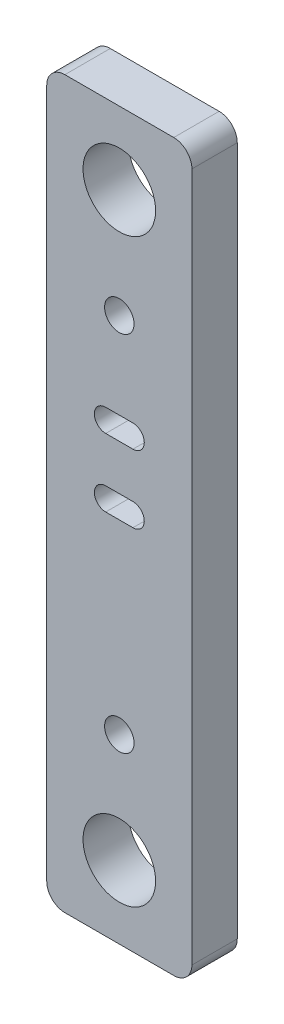
ISO-10303-21;
HEADER;
FILE_DESCRIPTION(('STEP AP214'),'2;1');
FILE_NAME('part.step','',(''),(''),'','','');
FILE_SCHEMA(('AUTOMOTIVE_DESIGN { 1 0 10303 214 1 1 1 1 }'));
ENDSEC;
DATA;
#1=APPLICATION_CONTEXT('core data for automotive mechanical design processes');
#2=APPLICATION_PROTOCOL_DEFINITION('international standard','automotive_design',2000,#1);
#3=PRODUCT_CONTEXT('',#1,'mechanical');
#4=PRODUCT('Part','Part','',(#3));
#5=PRODUCT_RELATED_PRODUCT_CATEGORY('part','',(#4));
#6=PRODUCT_DEFINITION_FORMATION('','',#4);
#7=PRODUCT_DEFINITION_CONTEXT('part definition',#1,'design');
#8=PRODUCT_DEFINITION('design','',#6,#7);
#9=PRODUCT_DEFINITION_SHAPE('','',#8);
#10=(LENGTH_UNIT() NAMED_UNIT(*) SI_UNIT(.MILLI.,.METRE.));
#11=(NAMED_UNIT(*) PLANE_ANGLE_UNIT() SI_UNIT($,.RADIAN.));
#12=(NAMED_UNIT(*) SI_UNIT($,.STERADIAN.) SOLID_ANGLE_UNIT());
#13=UNCERTAINTY_MEASURE_WITH_UNIT(LENGTH_MEASURE(1.E-05),#10,'distance_accuracy_value','');
#14=(GEOMETRIC_REPRESENTATION_CONTEXT(3) GLOBAL_UNCERTAINTY_ASSIGNED_CONTEXT((#13)) GLOBAL_UNIT_ASSIGNED_CONTEXT((#10,
#11,#12)) REPRESENTATION_CONTEXT('',''));
#15=CARTESIAN_POINT('',(0.,0.,0.));
#16=DIRECTION('',(0.,0.,1.));
#17=DIRECTION('',(1.,0.,0.));
#18=AXIS2_PLACEMENT_3D('',#15,#16,#17);
#19=CARTESIAN_POINT('',(0.,0.,5.));
#20=DIRECTION('',(0.,0.,-1.));
#21=DIRECTION('',(-1.,0.,0.));
#22=AXIS2_PLACEMENT_3D('',#19,#20,#21);
#23=PLANE('',#22);
#24=CARTESIAN_POINT('',(6.5,49.25,5.));
#25=DIRECTION('',(0.,0.,1.));
#26=DIRECTION('',(1.,0.,0.));
#27=AXIS2_PLACEMENT_3D('',#24,#25,#26);
#28=CIRCLE('',#27,1.24999999999999);
#29=CARTESIAN_POINT('',(6.5,50.5,5.));
#30=VERTEX_POINT('',#29);
#31=CARTESIAN_POINT('',(6.49999999999999,48.,5.));
#32=VERTEX_POINT('',#31);
#33=EDGE_CURVE('E206',#30,#32,#28,.T.);
#34=ORIENTED_EDGE('',*,*,#33,.F.);
#35=DIRECTION('',(-1.,0.,0.));
#36=VECTOR('',#35,1.);
#37=CARTESIAN_POINT('',(6.5,50.5,5.));
#38=LINE('',#37,#36);
#39=CARTESIAN_POINT('',(9.49999999999999,50.5,5.));
#40=VERTEX_POINT('',#39);
#41=EDGE_CURVE('E214',#40,#30,#38,.T.);
#42=ORIENTED_EDGE('',*,*,#41,.F.);
#43=CARTESIAN_POINT('',(9.49999999999999,49.25,5.));
#44=DIRECTION('',(0.,0.,1.));
#45=DIRECTION('',(1.,0.,0.));
#46=AXIS2_PLACEMENT_3D('',#43,#44,#45);
#47=CIRCLE('',#46,1.24999999999999);
#48=CARTESIAN_POINT('',(9.49999999999999,48.,5.));
#49=VERTEX_POINT('',#48);
#50=EDGE_CURVE('E211',#49,#40,#47,.T.);
#51=ORIENTED_EDGE('',*,*,#50,.F.);
#52=DIRECTION('',(1.,0.,0.));
#53=VECTOR('',#52,1.);
#54=CARTESIAN_POINT('',(6.49999999999999,48.,5.));
#55=LINE('',#54,#53);
#56=EDGE_CURVE('E208',#32,#49,#55,.T.);
#57=ORIENTED_EDGE('',*,*,#56,.F.);
#58=EDGE_LOOP('',(#34,#42,#51,#57));
#59=FACE_BOUND('',#58,.T.);
#60=DIRECTION('',(0.,-1.,0.));
#61=VECTOR('',#60,1.);
#62=CARTESIAN_POINT('',(0.,0.,5.));
#63=LINE('',#62,#61);
#64=CARTESIAN_POINT('',(0.,78.,5.));
#65=VERTEX_POINT('',#64);
#66=CARTESIAN_POINT('',(0.,2.,5.));
#67=VERTEX_POINT('',#66);
#68=EDGE_CURVE('E249',#65,#67,#63,.T.);
#69=ORIENTED_EDGE('',*,*,#68,.T.);
#70=CARTESIAN_POINT('',(2.,2.,5.));
#71=DIRECTION('',(0.,0.,-1.));
#72=DIRECTION('',(-1.,0.,0.));
#73=AXIS2_PLACEMENT_3D('',#70,#71,#72);
#74=CIRCLE('',#73,2.);
#75=CARTESIAN_POINT('',(2.,0.,5.));
#76=VERTEX_POINT('',#75);
#77=EDGE_CURVE('E292',#67,#76,#74,.F.);
#78=ORIENTED_EDGE('',*,*,#77,.T.);
#79=DIRECTION('',(1.,0.,0.));
#80=VECTOR('',#79,1.);
#81=CARTESIAN_POINT('',(0.,0.,5.));
#82=LINE('',#81,#80);
#83=CARTESIAN_POINT('',(14.,0.,5.));
#84=VERTEX_POINT('',#83);
#85=EDGE_CURVE('E252',#76,#84,#82,.T.);
#86=ORIENTED_EDGE('',*,*,#85,.T.);
#87=CARTESIAN_POINT('',(14.,2.,5.));
#88=DIRECTION('',(0.,0.,-1.));
#89=DIRECTION('',(-1.,0.,0.));
#90=AXIS2_PLACEMENT_3D('',#87,#88,#89);
#91=CIRCLE('',#90,2.);
#92=CARTESIAN_POINT('',(16.,2.,5.));
#93=VERTEX_POINT('',#92);
#94=EDGE_CURVE('E290',#84,#93,#91,.F.);
#95=ORIENTED_EDGE('',*,*,#94,.T.);
#96=DIRECTION('',(0.,1.,0.));
#97=VECTOR('',#96,1.);
#98=CARTESIAN_POINT('',(16.,0.,5.));
#99=LINE('',#98,#97);
#100=CARTESIAN_POINT('',(16.,78.,5.));
#101=VERTEX_POINT('',#100);
#102=EDGE_CURVE('E256',#93,#101,#99,.T.);
#103=ORIENTED_EDGE('',*,*,#102,.T.);
#104=CARTESIAN_POINT('',(14.,78.,5.));
#105=DIRECTION('',(0.,0.,-1.));
#106=DIRECTION('',(-1.,0.,0.));
#107=AXIS2_PLACEMENT_3D('',#104,#105,#106);
#108=CIRCLE('',#107,2.);
#109=CARTESIAN_POINT('',(14.,80.,5.));
#110=VERTEX_POINT('',#109);
#111=EDGE_CURVE('E68',#101,#110,#108,.F.);
#112=ORIENTED_EDGE('',*,*,#111,.T.);
#113=DIRECTION('',(-1.,0.,0.));
#114=VECTOR('',#113,1.);
#115=CARTESIAN_POINT('',(0.,80.,5.));
#116=LINE('',#115,#114);
#117=CARTESIAN_POINT('',(2.,80.,5.));
#118=VERTEX_POINT('',#117);
#119=EDGE_CURVE('E258',#110,#118,#116,.T.);
#120=ORIENTED_EDGE('',*,*,#119,.T.);
#121=CARTESIAN_POINT('',(2.,78.,5.));
#122=DIRECTION('',(0.,0.,-1.));
#123=DIRECTION('',(-1.,0.,0.));
#124=AXIS2_PLACEMENT_3D('',#121,#122,#123);
#125=CIRCLE('',#124,2.);
#126=EDGE_CURVE('E287',#118,#65,#125,.F.);
#127=ORIENTED_EDGE('',*,*,#126,.T.);
#128=EDGE_LOOP('',(#69,#78,#86,#95,#103,#112,#120,#127));
#129=FACE_BOUND('',#128,.T.);
#130=CARTESIAN_POINT('',(8.,72.,5.));
#131=DIRECTION('',(0.,0.,1.));
#132=DIRECTION('',(1.,0.,0.));
#133=AXIS2_PLACEMENT_3D('',#130,#131,#132);
#134=CIRCLE('',#133,4.00000000000001);
#135=CARTESIAN_POINT('',(12.,72.,5.));
#136=VERTEX_POINT('',#135);
#137=EDGE_CURVE('E243',#136,#136,#134,.T.);
#138=ORIENTED_EDGE('',*,*,#137,.F.);
#139=EDGE_LOOP('',(#138));
#140=FACE_BOUND('',#139,.T.);
#141=CARTESIAN_POINT('',(8.00000000000001,8.,5.));
#142=DIRECTION('',(0.,0.,1.));
#143=DIRECTION('',(1.,0.,0.));
#144=AXIS2_PLACEMENT_3D('',#141,#142,#143);
#145=CIRCLE('',#144,4.);
#146=CARTESIAN_POINT('',(12.,8.,5.));
#147=VERTEX_POINT('',#146);
#148=EDGE_CURVE('E237',#147,#147,#145,.T.);
#149=ORIENTED_EDGE('',*,*,#148,.F.);
#150=EDGE_LOOP('',(#149));
#151=FACE_BOUND('',#150,.T.);
#152=CARTESIAN_POINT('',(6.49999999999999,41.75,5.));
#153=DIRECTION('',(0.,0.,1.));
#154=DIRECTION('',(1.,0.,0.));
#155=AXIS2_PLACEMENT_3D('',#152,#153,#154);
#156=CIRCLE('',#155,1.25);
#157=CARTESIAN_POINT('',(6.49999999999999,43.,5.));
#158=VERTEX_POINT('',#157);
#159=CARTESIAN_POINT('',(6.49999999999999,40.5,5.));
#160=VERTEX_POINT('',#159);
#161=EDGE_CURVE('E162',#158,#160,#156,.T.);
#162=ORIENTED_EDGE('',*,*,#161,.F.);
#163=DIRECTION('',(-1.,0.,0.));
#164=VECTOR('',#163,1.);
#165=CARTESIAN_POINT('',(6.49999999999999,43.,5.));
#166=LINE('',#165,#164);
#167=CARTESIAN_POINT('',(9.5,43.,5.));
#168=VERTEX_POINT('',#167);
#169=EDGE_CURVE('E188',#168,#158,#166,.T.);
#170=ORIENTED_EDGE('',*,*,#169,.F.);
#171=CARTESIAN_POINT('',(9.49999999999999,41.75,5.));
#172=DIRECTION('',(0.,0.,1.));
#173=DIRECTION('',(1.,0.,0.));
#174=AXIS2_PLACEMENT_3D('',#171,#172,#173);
#175=CIRCLE('',#174,1.25);
#176=CARTESIAN_POINT('',(9.5,40.5,5.));
#177=VERTEX_POINT('',#176);
#178=EDGE_CURVE('E186',#177,#168,#175,.T.);
#179=ORIENTED_EDGE('',*,*,#178,.F.);
#180=DIRECTION('',(1.,0.,0.));
#181=VECTOR('',#180,1.);
#182=CARTESIAN_POINT('',(6.49999999999999,40.5,5.));
#183=LINE('',#182,#181);
#184=EDGE_CURVE('E172',#160,#177,#183,.T.);
#185=ORIENTED_EDGE('',*,*,#184,.F.);
#186=EDGE_LOOP('',(#162,#170,#179,#185));
#187=FACE_BOUND('',#186,.T.);
#188=CARTESIAN_POINT('',(8.00000000000001,20.,5.));
#189=DIRECTION('',(0.,0.,1.));
#190=DIRECTION('',(1.,0.,0.));
#191=AXIS2_PLACEMENT_3D('',#188,#189,#190);
#192=CIRCLE('',#191,1.625);
#193=CARTESIAN_POINT('',(9.62500000000001,20.,5.));
#194=VERTEX_POINT('',#193);
#195=EDGE_CURVE('E195',#194,#194,#192,.T.);
#196=ORIENTED_EDGE('',*,*,#195,.F.);
#197=EDGE_LOOP('',(#196));
#198=FACE_BOUND('',#197,.T.);
#199=CARTESIAN_POINT('',(8.,60.,5.));
#200=DIRECTION('',(0.,0.,1.));
#201=DIRECTION('',(1.,0.,0.));
#202=AXIS2_PLACEMENT_3D('',#199,#200,#201);
#203=CIRCLE('',#202,1.625);
#204=CARTESIAN_POINT('',(9.62500000000001,60.,5.));
#205=VERTEX_POINT('',#204);
#206=EDGE_CURVE('E533',#205,#205,#203,.T.);
#207=ORIENTED_EDGE('',*,*,#206,.F.);
#208=EDGE_LOOP('',(#207));
#209=FACE_BOUND('',#208,.T.);
#210=ADVANCED_FACE('F47',(#59,#129,#140,#151,#187,#198,#209),#23,.F.);
#211=CARTESIAN_POINT('',(0.,0.,0.));
#212=DIRECTION('',(0.,0.,-1.));
#213=DIRECTION('',(-1.,0.,0.));
#214=AXIS2_PLACEMENT_3D('',#211,#212,#213);
#215=PLANE('',#214);
#216=CARTESIAN_POINT('',(8.00000000000001,20.,0.));
#217=DIRECTION('',(0.,0.,1.));
#218=DIRECTION('',(1.,0.,0.));
#219=AXIS2_PLACEMENT_3D('',#216,#217,#218);
#220=CIRCLE('',#219,1.625);
#221=CARTESIAN_POINT('',(9.62500000000001,20.,0.));
#222=VERTEX_POINT('',#221);
#223=EDGE_CURVE('E539',#222,#222,#220,.T.);
#224=ORIENTED_EDGE('',*,*,#223,.T.);
#225=EDGE_LOOP('',(#224));
#226=FACE_BOUND('',#225,.T.);
#227=CARTESIAN_POINT('',(8.,72.,0.));
#228=DIRECTION('',(0.,0.,1.));
#229=DIRECTION('',(1.,0.,0.));
#230=AXIS2_PLACEMENT_3D('',#227,#228,#229);
#231=CIRCLE('',#230,4.00000000000001);
#232=CARTESIAN_POINT('',(12.,72.,0.));
#233=VERTEX_POINT('',#232);
#234=EDGE_CURVE('E240',#233,#233,#231,.T.);
#235=ORIENTED_EDGE('',*,*,#234,.T.);
#236=EDGE_LOOP('',(#235));
#237=FACE_BOUND('',#236,.T.);
#238=DIRECTION('',(1.,0.,0.));
#239=VECTOR('',#238,1.);
#240=CARTESIAN_POINT('',(0.,0.,0.));
#241=LINE('',#240,#239);
#242=CARTESIAN_POINT('',(2.,0.,0.));
#243=VERTEX_POINT('',#242);
#244=CARTESIAN_POINT('',(14.,0.,0.));
#245=VERTEX_POINT('',#244);
#246=EDGE_CURVE('E263',#243,#245,#241,.T.);
#247=ORIENTED_EDGE('',*,*,#246,.F.);
#248=CARTESIAN_POINT('',(2.,2.,0.));
#249=DIRECTION('',(0.,0.,-1.));
#250=DIRECTION('',(-1.,0.,0.));
#251=AXIS2_PLACEMENT_3D('',#248,#249,#250);
#252=CIRCLE('',#251,2.);
#253=CARTESIAN_POINT('',(0.,2.,0.));
#254=VERTEX_POINT('',#253);
#255=EDGE_CURVE('E280',#243,#254,#252,.T.);
#256=ORIENTED_EDGE('',*,*,#255,.T.);
#257=DIRECTION('',(0.,-1.,0.));
#258=VECTOR('',#257,1.);
#259=CARTESIAN_POINT('',(0.,0.,0.));
#260=LINE('',#259,#258);
#261=CARTESIAN_POINT('',(0.,78.,0.));
#262=VERTEX_POINT('',#261);
#263=EDGE_CURVE('E246',#262,#254,#260,.T.);
#264=ORIENTED_EDGE('',*,*,#263,.F.);
#265=CARTESIAN_POINT('',(2.,78.,0.));
#266=DIRECTION('',(0.,0.,-1.));
#267=DIRECTION('',(-1.,0.,0.));
#268=AXIS2_PLACEMENT_3D('',#265,#266,#267);
#269=CIRCLE('',#268,2.);
#270=CARTESIAN_POINT('',(2.,80.,0.));
#271=VERTEX_POINT('',#270);
#272=EDGE_CURVE('E274',#262,#271,#269,.T.);
#273=ORIENTED_EDGE('',*,*,#272,.T.);
#274=DIRECTION('',(-1.,0.,0.));
#275=VECTOR('',#274,1.);
#276=CARTESIAN_POINT('',(0.,80.,0.));
#277=LINE('',#276,#275);
#278=CARTESIAN_POINT('',(14.,80.,0.));
#279=VERTEX_POINT('',#278);
#280=EDGE_CURVE('E253',#279,#271,#277,.T.);
#281=ORIENTED_EDGE('',*,*,#280,.F.);
#282=CARTESIAN_POINT('',(14.,78.,0.));
#283=DIRECTION('',(0.,0.,-1.));
#284=DIRECTION('',(-1.,0.,0.));
#285=AXIS2_PLACEMENT_3D('',#282,#283,#284);
#286=CIRCLE('',#285,2.);
#287=CARTESIAN_POINT('',(16.,78.,0.));
#288=VERTEX_POINT('',#287);
#289=EDGE_CURVE('E276',#279,#288,#286,.T.);
#290=ORIENTED_EDGE('',*,*,#289,.T.);
#291=DIRECTION('',(0.,1.,0.));
#292=VECTOR('',#291,1.);
#293=CARTESIAN_POINT('',(16.,0.,0.));
#294=LINE('',#293,#292);
#295=CARTESIAN_POINT('',(16.,2.,0.));
#296=VERTEX_POINT('',#295);
#297=EDGE_CURVE('E266',#296,#288,#294,.T.);
#298=ORIENTED_EDGE('',*,*,#297,.F.);
#299=CARTESIAN_POINT('',(14.,2.,0.));
#300=DIRECTION('',(0.,0.,-1.));
#301=DIRECTION('',(-1.,0.,0.));
#302=AXIS2_PLACEMENT_3D('',#299,#300,#301);
#303=CIRCLE('',#302,2.);
#304=EDGE_CURVE('E278',#296,#245,#303,.T.);
#305=ORIENTED_EDGE('',*,*,#304,.T.);
#306=EDGE_LOOP('',(#247,#256,#264,#273,#281,#290,#298,#305));
#307=FACE_BOUND('',#306,.T.);
#308=CARTESIAN_POINT('',(8.00000000000001,8.,0.));
#309=DIRECTION('',(0.,0.,1.));
#310=DIRECTION('',(1.,0.,0.));
#311=AXIS2_PLACEMENT_3D('',#308,#309,#310);
#312=CIRCLE('',#311,4.);
#313=CARTESIAN_POINT('',(12.,8.,0.));
#314=VERTEX_POINT('',#313);
#315=EDGE_CURVE('E236',#314,#314,#312,.T.);
#316=ORIENTED_EDGE('',*,*,#315,.T.);
#317=EDGE_LOOP('',(#316));
#318=FACE_BOUND('',#317,.T.);
#319=DIRECTION('',(-1.,0.,0.));
#320=VECTOR('',#319,1.);
#321=CARTESIAN_POINT('',(6.5,50.5,0.));
#322=LINE('',#321,#320);
#323=CARTESIAN_POINT('',(9.49999999999999,50.5,0.));
#324=VERTEX_POINT('',#323);
#325=CARTESIAN_POINT('',(6.5,50.5,0.));
#326=VERTEX_POINT('',#325);
#327=EDGE_CURVE('E209',#324,#326,#322,.T.);
#328=ORIENTED_EDGE('',*,*,#327,.T.);
#329=CARTESIAN_POINT('',(6.5,49.25,0.));
#330=DIRECTION('',(0.,0.,1.));
#331=DIRECTION('',(1.,0.,0.));
#332=AXIS2_PLACEMENT_3D('',#329,#330,#331);
#333=CIRCLE('',#332,1.24999999999999);
#334=CARTESIAN_POINT('',(6.49999999999999,48.,0.));
#335=VERTEX_POINT('',#334);
#336=EDGE_CURVE('E180',#326,#335,#333,.T.);
#337=ORIENTED_EDGE('',*,*,#336,.T.);
#338=DIRECTION('',(1.,0.,0.));
#339=VECTOR('',#338,1.);
#340=CARTESIAN_POINT('',(6.49999999999999,48.,0.));
#341=LINE('',#340,#339);
#342=CARTESIAN_POINT('',(9.49999999999999,48.,0.));
#343=VERTEX_POINT('',#342);
#344=EDGE_CURVE('E219',#335,#343,#341,.T.);
#345=ORIENTED_EDGE('',*,*,#344,.T.);
#346=CARTESIAN_POINT('',(9.49999999999999,49.25,0.));
#347=DIRECTION('',(0.,0.,1.));
#348=DIRECTION('',(1.,0.,0.));
#349=AXIS2_PLACEMENT_3D('',#346,#347,#348);
#350=CIRCLE('',#349,1.24999999999999);
#351=EDGE_CURVE('E222',#343,#324,#350,.T.);
#352=ORIENTED_EDGE('',*,*,#351,.T.);
#353=EDGE_LOOP('',(#328,#337,#345,#352));
#354=FACE_BOUND('',#353,.T.);
#355=DIRECTION('',(-1.,0.,0.));
#356=VECTOR('',#355,1.);
#357=CARTESIAN_POINT('',(6.49999999999999,43.,0.));
#358=LINE('',#357,#356);
#359=CARTESIAN_POINT('',(9.5,43.,0.));
#360=VERTEX_POINT('',#359);
#361=CARTESIAN_POINT('',(6.49999999999999,43.,0.));
#362=VERTEX_POINT('',#361);
#363=EDGE_CURVE('E173',#360,#362,#358,.T.);
#364=ORIENTED_EDGE('',*,*,#363,.T.);
#365=CARTESIAN_POINT('',(6.49999999999999,41.75,0.));
#366=DIRECTION('',(0.,0.,1.));
#367=DIRECTION('',(1.,0.,0.));
#368=AXIS2_PLACEMENT_3D('',#365,#366,#367);
#369=CIRCLE('',#368,1.25);
#370=CARTESIAN_POINT('',(6.49999999999999,40.5,0.));
#371=VERTEX_POINT('',#370);
#372=EDGE_CURVE('E193',#362,#371,#369,.T.);
#373=ORIENTED_EDGE('',*,*,#372,.T.);
#374=DIRECTION('',(1.,0.,0.));
#375=VECTOR('',#374,1.);
#376=CARTESIAN_POINT('',(6.49999999999999,40.5,0.));
#377=LINE('',#376,#375);
#378=CARTESIAN_POINT('',(9.5,40.5,0.));
#379=VERTEX_POINT('',#378);
#380=EDGE_CURVE('E179',#371,#379,#377,.T.);
#381=ORIENTED_EDGE('',*,*,#380,.T.);
#382=CARTESIAN_POINT('',(9.49999999999999,41.75,0.));
#383=DIRECTION('',(0.,0.,1.));
#384=DIRECTION('',(1.,0.,0.));
#385=AXIS2_PLACEMENT_3D('',#382,#383,#384);
#386=CIRCLE('',#385,1.25);
#387=EDGE_CURVE('E197',#379,#360,#386,.T.);
#388=ORIENTED_EDGE('',*,*,#387,.T.);
#389=EDGE_LOOP('',(#364,#373,#381,#388));
#390=FACE_BOUND('',#389,.T.);
#391=CARTESIAN_POINT('',(8.,60.,0.));
#392=DIRECTION('',(0.,0.,1.));
#393=DIRECTION('',(1.,0.,0.));
#394=AXIS2_PLACEMENT_3D('',#391,#392,#393);
#395=CIRCLE('',#394,1.625);
#396=CARTESIAN_POINT('',(9.62500000000001,60.,0.));
#397=VERTEX_POINT('',#396);
#398=EDGE_CURVE('E536',#397,#397,#395,.T.);
#399=ORIENTED_EDGE('',*,*,#398,.T.);
#400=EDGE_LOOP('',(#399));
#401=FACE_BOUND('',#400,.T.);
#402=ADVANCED_FACE('F308',(#226,#237,#307,#318,#354,#390,#401),#215,.T.);
#403=CARTESIAN_POINT('',(0.,0.,5.));
#404=DIRECTION('',(1.,0.,0.));
#405=DIRECTION('',(0.,0.,-1.));
#406=AXIS2_PLACEMENT_3D('',#403,#404,#405);
#407=PLANE('',#406);
#408=ORIENTED_EDGE('',*,*,#263,.T.);
#409=DIRECTION('',(0.,0.,-1.));
#410=VECTOR('',#409,1.);
#411=CARTESIAN_POINT('',(0.,2.,5.));
#412=LINE('',#411,#410);
#413=EDGE_CURVE('E285',#254,#67,#412,.F.);
#414=ORIENTED_EDGE('',*,*,#413,.T.);
#415=ORIENTED_EDGE('',*,*,#68,.F.);
#416=DIRECTION('',(0.,0.,-1.));
#417=VECTOR('',#416,1.);
#418=CARTESIAN_POINT('',(0.,78.,5.));
#419=LINE('',#418,#417);
#420=EDGE_CURVE('E282',#65,#262,#419,.T.);
#421=ORIENTED_EDGE('',*,*,#420,.T.);
#422=EDGE_LOOP('',(#408,#414,#415,#421));
#423=FACE_BOUND('',#422,.T.);
#424=ADVANCED_FACE('F322',(#423),#407,.F.);
#425=CARTESIAN_POINT('',(0.,0.,5.));
#426=DIRECTION('',(0.,1.,0.));
#427=DIRECTION('',(-1.,0.,0.));
#428=AXIS2_PLACEMENT_3D('',#425,#426,#427);
#429=PLANE('',#428);
#430=ORIENTED_EDGE('',*,*,#85,.F.);
#431=DIRECTION('',(0.,0.,-1.));
#432=VECTOR('',#431,1.);
#433=CARTESIAN_POINT('',(2.,0.,5.));
#434=LINE('',#433,#432);
#435=EDGE_CURVE('E271',#76,#243,#434,.T.);
#436=ORIENTED_EDGE('',*,*,#435,.T.);
#437=ORIENTED_EDGE('',*,*,#246,.T.);
#438=DIRECTION('',(0.,0.,-1.));
#439=VECTOR('',#438,1.);
#440=CARTESIAN_POINT('',(14.,0.,5.));
#441=LINE('',#440,#439);
#442=EDGE_CURVE('E260',#245,#84,#441,.F.);
#443=ORIENTED_EDGE('',*,*,#442,.T.);
#444=EDGE_LOOP('',(#430,#436,#437,#443));
#445=FACE_BOUND('',#444,.T.);
#446=ADVANCED_FACE('F330',(#445),#429,.F.);
#447=CARTESIAN_POINT('',(16.,0.,5.));
#448=DIRECTION('',(-1.,0.,0.));
#449=DIRECTION('',(0.,-1.,0.));
#450=AXIS2_PLACEMENT_3D('',#447,#448,#449);
#451=PLANE('',#450);
#452=ORIENTED_EDGE('',*,*,#102,.F.);
#453=DIRECTION('',(0.,0.,-1.));
#454=VECTOR('',#453,1.);
#455=CARTESIAN_POINT('',(16.,2.,5.));
#456=LINE('',#455,#454);
#457=EDGE_CURVE('E296',#93,#296,#456,.T.);
#458=ORIENTED_EDGE('',*,*,#457,.T.);
#459=ORIENTED_EDGE('',*,*,#297,.T.);
#460=DIRECTION('',(0.,0.,-1.));
#461=VECTOR('',#460,1.);
#462=CARTESIAN_POINT('',(16.,78.,5.));
#463=LINE('',#462,#461);
#464=EDGE_CURVE('E294',#288,#101,#463,.F.);
#465=ORIENTED_EDGE('',*,*,#464,.T.);
#466=EDGE_LOOP('',(#452,#458,#459,#465));
#467=FACE_BOUND('',#466,.T.);
#468=ADVANCED_FACE('F302',(#467),#451,.F.);
#469=CARTESIAN_POINT('',(0.,80.,5.));
#470=DIRECTION('',(0.,-1.,0.));
#471=DIRECTION('',(0.,0.,-1.));
#472=AXIS2_PLACEMENT_3D('',#469,#470,#471);
#473=PLANE('',#472);
#474=ORIENTED_EDGE('',*,*,#119,.F.);
#475=DIRECTION('',(0.,0.,-1.));
#476=VECTOR('',#475,1.);
#477=CARTESIAN_POINT('',(14.,80.,5.));
#478=LINE('',#477,#476);
#479=EDGE_CURVE('E13',#110,#279,#478,.T.);
#480=ORIENTED_EDGE('',*,*,#479,.T.);
#481=ORIENTED_EDGE('',*,*,#280,.T.);
#482=DIRECTION('',(0.,0.,-1.));
#483=VECTOR('',#482,1.);
#484=CARTESIAN_POINT('',(2.,80.,5.));
#485=LINE('',#484,#483);
#486=EDGE_CURVE('E55',#271,#118,#485,.F.);
#487=ORIENTED_EDGE('',*,*,#486,.T.);
#488=EDGE_LOOP('',(#474,#480,#481,#487));
#489=FACE_BOUND('',#488,.T.);
#490=ADVANCED_FACE('F314',(#489),#473,.F.);
#491=CARTESIAN_POINT('',(8.,72.,5.));
#492=DIRECTION('',(0.,0.,-1.));
#493=DIRECTION('',(-1.,0.,0.));
#494=AXIS2_PLACEMENT_3D('',#491,#492,#493);
#495=CYLINDRICAL_SURFACE('',#494,4.00000000000001);
#496=ORIENTED_EDGE('',*,*,#137,.T.);
#497=EDGE_LOOP('',(#496));
#498=FACE_BOUND('',#497,.T.);
#499=ORIENTED_EDGE('',*,*,#234,.F.);
#500=EDGE_LOOP('',(#499));
#501=FACE_BOUND('',#500,.T.);
#502=ADVANCED_FACE('F351',(#498,#501),#495,.F.);
#503=CARTESIAN_POINT('',(8.00000000000001,8.,5.));
#504=DIRECTION('',(0.,0.,-1.));
#505=DIRECTION('',(-1.,0.,0.));
#506=AXIS2_PLACEMENT_3D('',#503,#504,#505);
#507=CYLINDRICAL_SURFACE('',#506,4.);
#508=ORIENTED_EDGE('',*,*,#148,.T.);
#509=EDGE_LOOP('',(#508));
#510=FACE_BOUND('',#509,.T.);
#511=ORIENTED_EDGE('',*,*,#315,.F.);
#512=EDGE_LOOP('',(#511));
#513=FACE_BOUND('',#512,.T.);
#514=ADVANCED_FACE('F384',(#510,#513),#507,.F.);
#515=CARTESIAN_POINT('',(6.5,49.25,5.));
#516=DIRECTION('',(0.,0.,-1.));
#517=DIRECTION('',(-1.,0.,0.));
#518=AXIS2_PLACEMENT_3D('',#515,#516,#517);
#519=CYLINDRICAL_SURFACE('',#518,1.24999999999999);
#520=ORIENTED_EDGE('',*,*,#336,.F.);
#521=DIRECTION('',(0.,0.,-1.));
#522=VECTOR('',#521,1.);
#523=CARTESIAN_POINT('',(6.5,50.5,5.));
#524=LINE('',#523,#522);
#525=EDGE_CURVE('E216',#30,#326,#524,.T.);
#526=ORIENTED_EDGE('',*,*,#525,.F.);
#527=ORIENTED_EDGE('',*,*,#33,.T.);
#528=DIRECTION('',(0.,0.,-1.));
#529=VECTOR('',#528,1.);
#530=CARTESIAN_POINT('',(6.49999999999999,48.,5.));
#531=LINE('',#530,#529);
#532=EDGE_CURVE('E233',#32,#335,#531,.T.);
#533=ORIENTED_EDGE('',*,*,#532,.T.);
#534=EDGE_LOOP('',(#520,#526,#527,#533));
#535=FACE_BOUND('',#534,.T.);
#536=ADVANCED_FACE('F391',(#535),#519,.F.);
#537=CARTESIAN_POINT('',(6.49999999999999,48.,5.));
#538=DIRECTION('',(0.,1.,0.));
#539=DIRECTION('',(0.,0.,1.));
#540=AXIS2_PLACEMENT_3D('',#537,#538,#539);
#541=PLANE('',#540);
#542=ORIENTED_EDGE('',*,*,#344,.F.);
#543=ORIENTED_EDGE('',*,*,#532,.F.);
#544=ORIENTED_EDGE('',*,*,#56,.T.);
#545=DIRECTION('',(0.,0.,-1.));
#546=VECTOR('',#545,1.);
#547=CARTESIAN_POINT('',(9.49999999999999,48.,5.));
#548=LINE('',#547,#546);
#549=EDGE_CURVE('E231',#49,#343,#548,.T.);
#550=ORIENTED_EDGE('',*,*,#549,.T.);
#551=EDGE_LOOP('',(#542,#543,#544,#550));
#552=FACE_BOUND('',#551,.T.);
#553=ADVANCED_FACE('F398',(#552),#541,.T.);
#554=CARTESIAN_POINT('',(9.49999999999999,49.25,5.));
#555=DIRECTION('',(0.,0.,-1.));
#556=DIRECTION('',(-1.,0.,0.));
#557=AXIS2_PLACEMENT_3D('',#554,#555,#556);
#558=CYLINDRICAL_SURFACE('',#557,1.24999999999999);
#559=ORIENTED_EDGE('',*,*,#351,.F.);
#560=ORIENTED_EDGE('',*,*,#549,.F.);
#561=ORIENTED_EDGE('',*,*,#50,.T.);
#562=DIRECTION('',(0.,0.,-1.));
#563=VECTOR('',#562,1.);
#564=CARTESIAN_POINT('',(9.49999999999999,50.5,5.));
#565=LINE('',#564,#563);
#566=EDGE_CURVE('E229',#40,#324,#565,.T.);
#567=ORIENTED_EDGE('',*,*,#566,.T.);
#568=EDGE_LOOP('',(#559,#560,#561,#567));
#569=FACE_BOUND('',#568,.T.);
#570=ADVANCED_FACE('F406',(#569),#558,.F.);
#571=CARTESIAN_POINT('',(6.5,50.5,5.));
#572=DIRECTION('',(0.,-1.,0.));
#573=DIRECTION('',(0.,0.,-1.));
#574=AXIS2_PLACEMENT_3D('',#571,#572,#573);
#575=PLANE('',#574);
#576=ORIENTED_EDGE('',*,*,#327,.F.);
#577=ORIENTED_EDGE('',*,*,#566,.F.);
#578=ORIENTED_EDGE('',*,*,#41,.T.);
#579=ORIENTED_EDGE('',*,*,#525,.T.);
#580=EDGE_LOOP('',(#576,#577,#578,#579));
#581=FACE_BOUND('',#580,.T.);
#582=ADVANCED_FACE('F414',(#581),#575,.T.);
#583=CARTESIAN_POINT('',(6.49999999999999,41.75,5.));
#584=DIRECTION('',(0.,0.,-1.));
#585=DIRECTION('',(-1.,0.,0.));
#586=AXIS2_PLACEMENT_3D('',#583,#584,#585);
#587=CYLINDRICAL_SURFACE('',#586,1.25);
#588=ORIENTED_EDGE('',*,*,#372,.F.);
#589=DIRECTION('',(0.,0.,-1.));
#590=VECTOR('',#589,1.);
#591=CARTESIAN_POINT('',(6.49999999999999,43.,5.));
#592=LINE('',#591,#590);
#593=EDGE_CURVE('E168',#158,#362,#592,.T.);
#594=ORIENTED_EDGE('',*,*,#593,.F.);
#595=ORIENTED_EDGE('',*,*,#161,.T.);
#596=DIRECTION('',(0.,0.,-1.));
#597=VECTOR('',#596,1.);
#598=CARTESIAN_POINT('',(6.49999999999999,40.5,5.));
#599=LINE('',#598,#597);
#600=EDGE_CURVE('E165',#160,#371,#599,.T.);
#601=ORIENTED_EDGE('',*,*,#600,.T.);
#602=EDGE_LOOP('',(#588,#594,#595,#601));
#603=FACE_BOUND('',#602,.T.);
#604=ADVANCED_FACE('F164',(#603),#587,.F.);
#605=CARTESIAN_POINT('',(6.49999999999999,40.5,5.));
#606=DIRECTION('',(0.,1.,0.));
#607=DIRECTION('',(0.,0.,1.));
#608=AXIS2_PLACEMENT_3D('',#605,#606,#607);
#609=PLANE('',#608);
#610=ORIENTED_EDGE('',*,*,#380,.F.);
#611=ORIENTED_EDGE('',*,*,#600,.F.);
#612=ORIENTED_EDGE('',*,*,#184,.T.);
#613=DIRECTION('',(0.,0.,-1.));
#614=VECTOR('',#613,1.);
#615=CARTESIAN_POINT('',(9.5,40.5,5.));
#616=LINE('',#615,#614);
#617=EDGE_CURVE('E181',#177,#379,#616,.T.);
#618=ORIENTED_EDGE('',*,*,#617,.T.);
#619=EDGE_LOOP('',(#610,#611,#612,#618));
#620=FACE_BOUND('',#619,.T.);
#621=ADVANCED_FACE('F176',(#620),#609,.T.);
#622=CARTESIAN_POINT('',(9.49999999999999,41.75,5.));
#623=DIRECTION('',(0.,0.,-1.));
#624=DIRECTION('',(-1.,0.,0.));
#625=AXIS2_PLACEMENT_3D('',#622,#623,#624);
#626=CYLINDRICAL_SURFACE('',#625,1.25);
#627=ORIENTED_EDGE('',*,*,#387,.F.);
#628=ORIENTED_EDGE('',*,*,#617,.F.);
#629=ORIENTED_EDGE('',*,*,#178,.T.);
#630=DIRECTION('',(0.,0.,-1.));
#631=VECTOR('',#630,1.);
#632=CARTESIAN_POINT('',(9.5,43.,5.));
#633=LINE('',#632,#631);
#634=EDGE_CURVE('E203',#168,#360,#633,.T.);
#635=ORIENTED_EDGE('',*,*,#634,.T.);
#636=EDGE_LOOP('',(#627,#628,#629,#635));
#637=FACE_BOUND('',#636,.T.);
#638=ADVANCED_FACE('F435',(#637),#626,.F.);
#639=CARTESIAN_POINT('',(6.49999999999999,43.,5.));
#640=DIRECTION('',(0.,-1.,0.));
#641=DIRECTION('',(0.,0.,-1.));
#642=AXIS2_PLACEMENT_3D('',#639,#640,#641);
#643=PLANE('',#642);
#644=ORIENTED_EDGE('',*,*,#363,.F.);
#645=ORIENTED_EDGE('',*,*,#634,.F.);
#646=ORIENTED_EDGE('',*,*,#169,.T.);
#647=ORIENTED_EDGE('',*,*,#593,.T.);
#648=EDGE_LOOP('',(#644,#645,#646,#647));
#649=FACE_BOUND('',#648,.T.);
#650=ADVANCED_FACE('F442',(#649),#643,.T.);
#651=CARTESIAN_POINT('',(8.00000000000001,20.,5.));
#652=DIRECTION('',(0.,0.,-1.));
#653=DIRECTION('',(-1.,0.,0.));
#654=AXIS2_PLACEMENT_3D('',#651,#652,#653);
#655=CYLINDRICAL_SURFACE('',#654,1.625);
#656=ORIENTED_EDGE('',*,*,#195,.T.);
#657=EDGE_LOOP('',(#656));
#658=FACE_BOUND('',#657,.T.);
#659=ORIENTED_EDGE('',*,*,#223,.F.);
#660=EDGE_LOOP('',(#659));
#661=FACE_BOUND('',#660,.T.);
#662=ADVANCED_FACE('F450',(#658,#661),#655,.F.);
#663=CARTESIAN_POINT('',(8.,60.,5.));
#664=DIRECTION('',(0.,0.,-1.));
#665=DIRECTION('',(-1.,0.,0.));
#666=AXIS2_PLACEMENT_3D('',#663,#664,#665);
#667=CYLINDRICAL_SURFACE('',#666,1.625);
#668=ORIENTED_EDGE('',*,*,#206,.T.);
#669=EDGE_LOOP('',(#668));
#670=FACE_BOUND('',#669,.T.);
#671=ORIENTED_EDGE('',*,*,#398,.F.);
#672=EDGE_LOOP('',(#671));
#673=FACE_BOUND('',#672,.T.);
#674=ADVANCED_FACE('F339',(#670,#673),#667,.F.);
#675=CARTESIAN_POINT('',(2.,2.,5.));
#676=DIRECTION('',(0.,0.,-1.));
#677=DIRECTION('',(-1.,0.,0.));
#678=AXIS2_PLACEMENT_3D('',#675,#676,#677);
#679=CYLINDRICAL_SURFACE('',#678,2.);
#680=ORIENTED_EDGE('',*,*,#77,.F.);
#681=ORIENTED_EDGE('',*,*,#413,.F.);
#682=ORIENTED_EDGE('',*,*,#255,.F.);
#683=ORIENTED_EDGE('',*,*,#435,.F.);
#684=EDGE_LOOP('',(#680,#681,#682,#683));
#685=FACE_BOUND('',#684,.T.);
#686=ADVANCED_FACE('F327',(#685),#679,.T.);
#687=CARTESIAN_POINT('',(14.,2.,5.));
#688=DIRECTION('',(0.,0.,-1.));
#689=DIRECTION('',(-1.,0.,0.));
#690=AXIS2_PLACEMENT_3D('',#687,#688,#689);
#691=CYLINDRICAL_SURFACE('',#690,2.);
#692=ORIENTED_EDGE('',*,*,#94,.F.);
#693=ORIENTED_EDGE('',*,*,#442,.F.);
#694=ORIENTED_EDGE('',*,*,#304,.F.);
#695=ORIENTED_EDGE('',*,*,#457,.F.);
#696=EDGE_LOOP('',(#692,#693,#694,#695));
#697=FACE_BOUND('',#696,.T.);
#698=ADVANCED_FACE('F332',(#697),#691,.T.);
#699=CARTESIAN_POINT('',(14.,78.,5.));
#700=DIRECTION('',(0.,0.,-1.));
#701=DIRECTION('',(-1.,0.,0.));
#702=AXIS2_PLACEMENT_3D('',#699,#700,#701);
#703=CYLINDRICAL_SURFACE('',#702,2.);
#704=ORIENTED_EDGE('',*,*,#111,.F.);
#705=ORIENTED_EDGE('',*,*,#464,.F.);
#706=ORIENTED_EDGE('',*,*,#289,.F.);
#707=ORIENTED_EDGE('',*,*,#479,.F.);
#708=EDGE_LOOP('',(#704,#705,#706,#707));
#709=FACE_BOUND('',#708,.T.);
#710=ADVANCED_FACE('F313',(#709),#703,.T.);
#711=CARTESIAN_POINT('',(2.,78.,5.));
#712=DIRECTION('',(0.,0.,-1.));
#713=DIRECTION('',(-1.,0.,0.));
#714=AXIS2_PLACEMENT_3D('',#711,#712,#713);
#715=CYLINDRICAL_SURFACE('',#714,2.);
#716=ORIENTED_EDGE('',*,*,#126,.F.);
#717=ORIENTED_EDGE('',*,*,#486,.F.);
#718=ORIENTED_EDGE('',*,*,#272,.F.);
#719=ORIENTED_EDGE('',*,*,#420,.F.);
#720=EDGE_LOOP('',(#716,#717,#718,#719));
#721=FACE_BOUND('',#720,.T.);
#722=ADVANCED_FACE('F49',(#721),#715,.T.);
#723=CLOSED_SHELL('',(#210,#402,#424,#446,#468,#490,#502,#514,#536,#553,#570,#582,#604,#621,
#638,#650,#662,#674,#686,#698,#710,#722));
#724=MANIFOLD_SOLID_BREP('B2',#723);
#725=ADVANCED_BREP_SHAPE_REPRESENTATION('',(#18,#724),#14);
#726=SHAPE_DEFINITION_REPRESENTATION(#9,#725);
ENDSEC;
END-ISO-10303-21;
